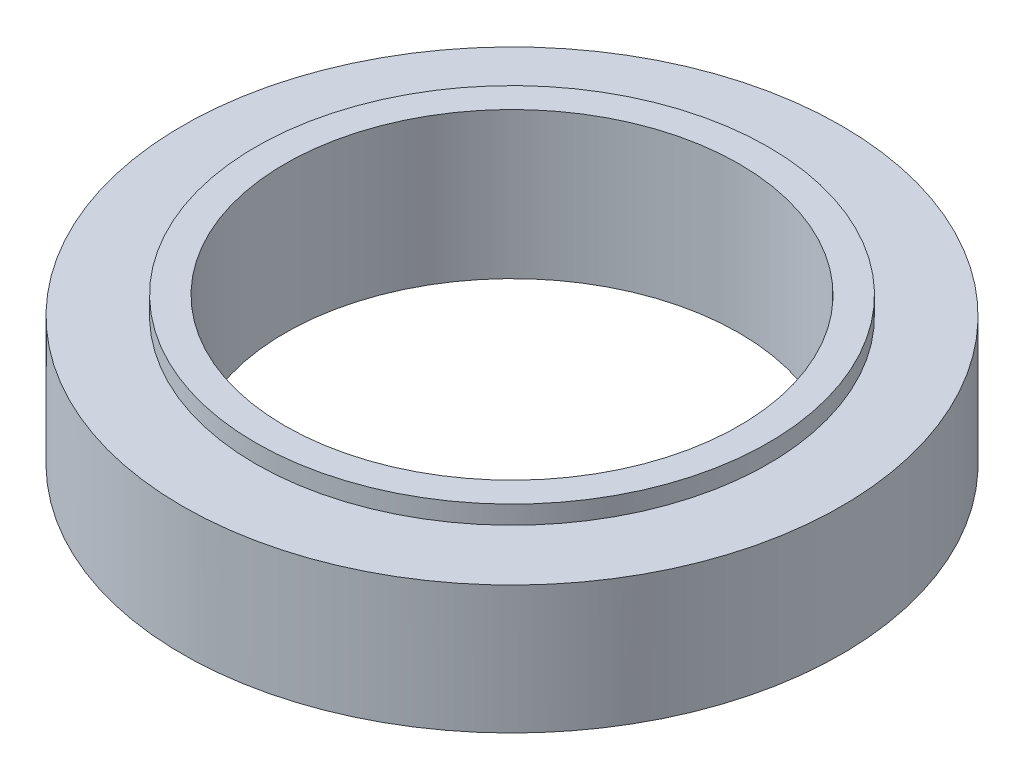
ISO-10303-21;
HEADER;
FILE_DESCRIPTION(('STEP AP214'),'2;1');
FILE_NAME('part.step','',(''),(''),'','','');
FILE_SCHEMA(('AUTOMOTIVE_DESIGN { 1 0 10303 214 1 1 1 1 }'));
ENDSEC;
DATA;
#1=APPLICATION_CONTEXT('core data for automotive mechanical design processes');
#2=APPLICATION_PROTOCOL_DEFINITION('international standard','automotive_design',2000,#1);
#3=PRODUCT_CONTEXT('',#1,'mechanical');
#4=PRODUCT('Part','Part','',(#3));
#5=PRODUCT_RELATED_PRODUCT_CATEGORY('part','',(#4));
#6=PRODUCT_DEFINITION_FORMATION('','',#4);
#7=PRODUCT_DEFINITION_CONTEXT('part definition',#1,'design');
#8=PRODUCT_DEFINITION('design','',#6,#7);
#9=PRODUCT_DEFINITION_SHAPE('','',#8);
#10=(LENGTH_UNIT() NAMED_UNIT(*) SI_UNIT(.MILLI.,.METRE.));
#11=(NAMED_UNIT(*) PLANE_ANGLE_UNIT() SI_UNIT($,.RADIAN.));
#12=(NAMED_UNIT(*) SI_UNIT($,.STERADIAN.) SOLID_ANGLE_UNIT());
#13=UNCERTAINTY_MEASURE_WITH_UNIT(LENGTH_MEASURE(1.E-05),#10,'distance_accuracy_value','');
#14=(GEOMETRIC_REPRESENTATION_CONTEXT(3) GLOBAL_UNCERTAINTY_ASSIGNED_CONTEXT((#13)) GLOBAL_UNIT_ASSIGNED_CONTEXT((#10,
#11,#12)) REPRESENTATION_CONTEXT('',''));
#15=CARTESIAN_POINT('',(0.,0.,0.));
#16=DIRECTION('',(0.,0.,1.));
#17=DIRECTION('',(1.,0.,0.));
#18=AXIS2_PLACEMENT_3D('',#15,#16,#17);
#19=CARTESIAN_POINT('',(0.,4.,0.));
#20=DIRECTION('',(0.,1.,0.));
#21=DIRECTION('',(0.,0.,1.));
#22=AXIS2_PLACEMENT_3D('',#19,#20,#21);
#23=PLANE('',#22);
#24=CARTESIAN_POINT('',(0.,4.,0.));
#25=DIRECTION('',(0.,1.,0.));
#26=DIRECTION('',(0.,0.,1.));
#27=AXIS2_PLACEMENT_3D('',#24,#25,#26);
#28=CIRCLE('',#27,7.);
#29=CARTESIAN_POINT('',(0.,4.,7.));
#30=VERTEX_POINT('',#29);
#31=EDGE_CURVE('E11',#30,#30,#28,.T.);
#32=ORIENTED_EDGE('',*,*,#31,.T.);
#33=EDGE_LOOP('',(#32));
#34=FACE_BOUND('',#33,.T.);
#35=CARTESIAN_POINT('',(0.,4.,0.));
#36=DIRECTION('',(0.,1.,0.));
#37=DIRECTION('',(0.,0.,1.));
#38=AXIS2_PLACEMENT_3D('',#35,#36,#37);
#39=CIRCLE('',#38,6.2);
#40=CARTESIAN_POINT('',(0.,4.,6.2));
#41=VERTEX_POINT('',#40);
#42=EDGE_CURVE('E41',#41,#41,#39,.T.);
#43=ORIENTED_EDGE('',*,*,#42,.F.);
#44=EDGE_LOOP('',(#43));
#45=FACE_BOUND('',#44,.T.);
#46=ADVANCED_FACE('F34',(#34,#45),#23,.T.);
#47=CARTESIAN_POINT('',(0.,0.,0.));
#48=DIRECTION('',(0.,1.,0.));
#49=DIRECTION('',(0.,0.,1.));
#50=AXIS2_PLACEMENT_3D('',#47,#48,#49);
#51=PLANE('',#50);
#52=CARTESIAN_POINT('',(0.,0.,0.));
#53=DIRECTION('',(0.,1.,0.));
#54=DIRECTION('',(0.,0.,1.));
#55=AXIS2_PLACEMENT_3D('',#52,#53,#54);
#56=CIRCLE('',#55,6.2);
#57=CARTESIAN_POINT('',(0.,0.,6.2));
#58=VERTEX_POINT('',#57);
#59=EDGE_CURVE('E45',#58,#58,#56,.T.);
#60=ORIENTED_EDGE('',*,*,#59,.T.);
#61=EDGE_LOOP('',(#60));
#62=FACE_BOUND('',#61,.T.);
#63=CARTESIAN_POINT('',(0.,0.,0.));
#64=DIRECTION('',(0.,-1.,0.));
#65=DIRECTION('',(0.,0.,-1.));
#66=AXIS2_PLACEMENT_3D('',#63,#64,#65);
#67=CIRCLE('',#66,9.);
#68=CARTESIAN_POINT('',(0.,0.,-9.));
#69=VERTEX_POINT('',#68);
#70=EDGE_CURVE('E55',#69,#69,#67,.T.);
#71=ORIENTED_EDGE('',*,*,#70,.T.);
#72=EDGE_LOOP('',(#71));
#73=FACE_BOUND('',#72,.T.);
#74=ADVANCED_FACE('F61',(#62,#73),#51,.F.);
#75=CARTESIAN_POINT('',(0.,4.,0.));
#76=DIRECTION('',(0.,-1.,0.));
#77=DIRECTION('',(0.,0.,-1.));
#78=AXIS2_PLACEMENT_3D('',#75,#76,#77);
#79=CYLINDRICAL_SURFACE('',#78,7.);
#80=CARTESIAN_POINT('',(0.,3.5,0.));
#81=DIRECTION('',(0.,1.,0.));
#82=DIRECTION('',(0.,0.,1.));
#83=AXIS2_PLACEMENT_3D('',#80,#81,#82);
#84=CIRCLE('',#83,7.);
#85=CARTESIAN_POINT('',(0.,3.5,7.));
#86=VERTEX_POINT('',#85);
#87=EDGE_CURVE('E50',#86,#86,#84,.F.);
#88=ORIENTED_EDGE('',*,*,#87,.F.);
#89=EDGE_LOOP('',(#88));
#90=FACE_BOUND('',#89,.T.);
#91=ORIENTED_EDGE('',*,*,#31,.F.);
#92=EDGE_LOOP('',(#91));
#93=FACE_BOUND('',#92,.T.);
#94=ADVANCED_FACE('F36',(#90,#93),#79,.T.);
#95=CARTESIAN_POINT('',(0.,4.,0.));
#96=DIRECTION('',(0.,-1.,0.));
#97=DIRECTION('',(0.,0.,-1.));
#98=AXIS2_PLACEMENT_3D('',#95,#96,#97);
#99=CYLINDRICAL_SURFACE('',#98,6.2);
#100=ORIENTED_EDGE('',*,*,#42,.T.);
#101=EDGE_LOOP('',(#100));
#102=FACE_BOUND('',#101,.T.);
#103=ORIENTED_EDGE('',*,*,#59,.F.);
#104=EDGE_LOOP('',(#103));
#105=FACE_BOUND('',#104,.T.);
#106=ADVANCED_FACE('F67',(#102,#105),#99,.F.);
#107=CARTESIAN_POINT('',(0.,29.4558441227157,0.));
#108=DIRECTION('',(0.,-1.,0.));
#109=DIRECTION('',(0.,0.,-1.));
#110=AXIS2_PLACEMENT_3D('',#107,#108,#109);
#111=CYLINDRICAL_SURFACE('',#110,9.);
#112=ORIENTED_EDGE('',*,*,#70,.F.);
#113=EDGE_LOOP('',(#112));
#114=FACE_BOUND('',#113,.T.);
#115=CARTESIAN_POINT('',(0.,3.5,0.));
#116=DIRECTION('',(0.,1.,0.));
#117=DIRECTION('',(0.,0.,1.));
#118=AXIS2_PLACEMENT_3D('',#115,#116,#117);
#119=CIRCLE('',#118,9.);
#120=CARTESIAN_POINT('',(0.,3.5,9.));
#121=VERTEX_POINT('',#120);
#122=EDGE_CURVE('E52',#121,#121,#119,.F.);
#123=ORIENTED_EDGE('',*,*,#122,.T.);
#124=EDGE_LOOP('',(#123));
#125=FACE_BOUND('',#124,.T.);
#126=ADVANCED_FACE('F63',(#114,#125),#111,.T.);
#127=CARTESIAN_POINT('',(0.,3.5,0.));
#128=DIRECTION('',(0.,1.,0.));
#129=DIRECTION('',(0.,0.,1.));
#130=AXIS2_PLACEMENT_3D('',#127,#128,#129);
#131=PLANE('',#130);
#132=ORIENTED_EDGE('',*,*,#122,.F.);
#133=EDGE_LOOP('',(#132));
#134=FACE_BOUND('',#133,.T.);
#135=ORIENTED_EDGE('',*,*,#87,.T.);
#136=EDGE_LOOP('',(#135));
#137=FACE_BOUND('',#136,.T.);
#138=ADVANCED_FACE('F66',(#134,#137),#131,.T.);
#139=CLOSED_SHELL('',(#46,#74,#94,#106,#126,#138));
#140=MANIFOLD_SOLID_BREP('B2',#139);
#141=ADVANCED_BREP_SHAPE_REPRESENTATION('',(#18,#140),#14);
#142=SHAPE_DEFINITION_REPRESENTATION(#9,#141);
ENDSEC;
END-ISO-10303-21;
